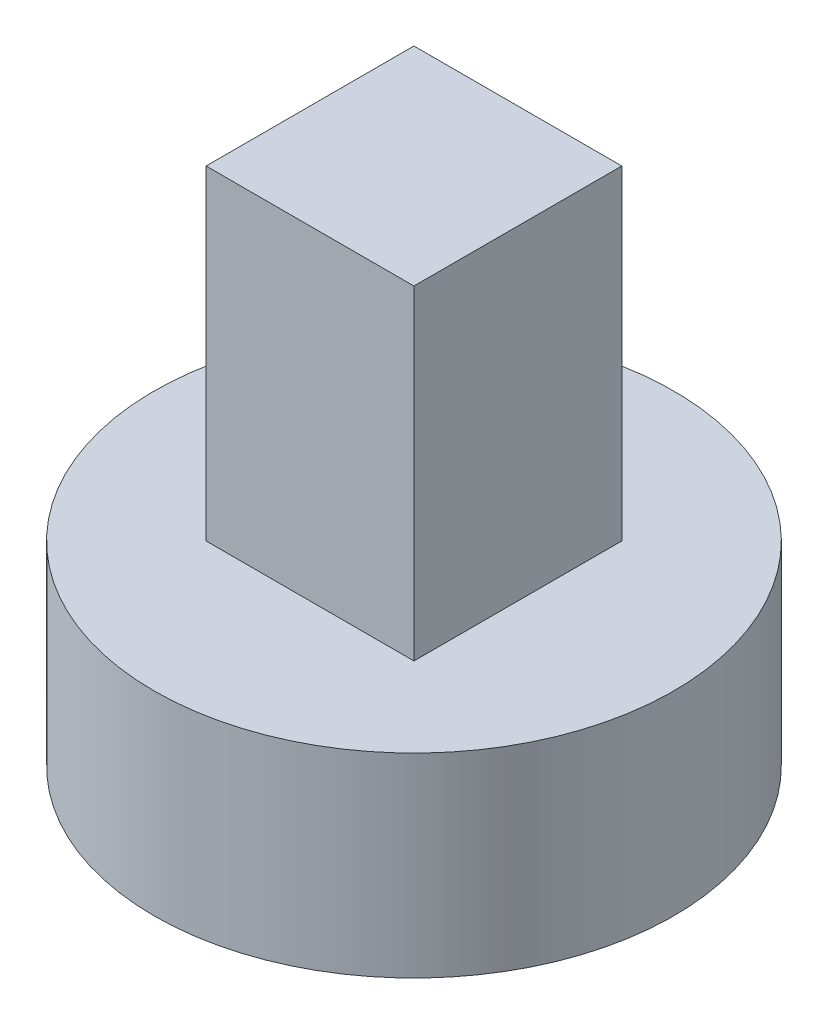
ISO-10303-21;
HEADER;
FILE_DESCRIPTION(('STEP AP214'),'2;1');
FILE_NAME('part.step','',(''),(''),'','','');
FILE_SCHEMA(('AUTOMOTIVE_DESIGN { 1 0 10303 214 1 1 1 1 }'));
ENDSEC;
DATA;
#1=APPLICATION_CONTEXT('core data for automotive mechanical design processes');
#2=APPLICATION_PROTOCOL_DEFINITION('international standard','automotive_design',2000,#1);
#3=PRODUCT_CONTEXT('',#1,'mechanical');
#4=PRODUCT('Part','Part','',(#3));
#5=PRODUCT_RELATED_PRODUCT_CATEGORY('part','',(#4));
#6=PRODUCT_DEFINITION_FORMATION('','',#4);
#7=PRODUCT_DEFINITION_CONTEXT('part definition',#1,'design');
#8=PRODUCT_DEFINITION('design','',#6,#7);
#9=PRODUCT_DEFINITION_SHAPE('','',#8);
#10=(LENGTH_UNIT() NAMED_UNIT(*) SI_UNIT(.MILLI.,.METRE.));
#11=(NAMED_UNIT(*) PLANE_ANGLE_UNIT() SI_UNIT($,.RADIAN.));
#12=(NAMED_UNIT(*) SI_UNIT($,.STERADIAN.) SOLID_ANGLE_UNIT());
#13=UNCERTAINTY_MEASURE_WITH_UNIT(LENGTH_MEASURE(1.E-05),#10,'distance_accuracy_value','');
#14=(GEOMETRIC_REPRESENTATION_CONTEXT(3) GLOBAL_UNCERTAINTY_ASSIGNED_CONTEXT((#13)) GLOBAL_UNIT_ASSIGNED_CONTEXT((#10,
#11,#12)) REPRESENTATION_CONTEXT('',''));
#15=CARTESIAN_POINT('',(0.,0.,0.));
#16=DIRECTION('',(0.,0.,1.));
#17=DIRECTION('',(1.,0.,0.));
#18=AXIS2_PLACEMENT_3D('',#15,#16,#17);
#19=CARTESIAN_POINT('',(0.,3.,0.));
#20=DIRECTION('',(0.,-1.,0.));
#21=DIRECTION('',(0.,0.,-1.));
#22=AXIS2_PLACEMENT_3D('',#19,#20,#21);
#23=CYLINDRICAL_SURFACE('',#22,4.);
#24=CARTESIAN_POINT('',(0.,3.,0.));
#25=DIRECTION('',(0.,1.,0.));
#26=DIRECTION('',(0.,0.,1.));
#27=AXIS2_PLACEMENT_3D('',#24,#25,#26);
#28=CIRCLE('',#27,4.);
#29=CARTESIAN_POINT('',(0.,3.,4.));
#30=VERTEX_POINT('',#29);
#31=EDGE_CURVE('E11',#30,#30,#28,.T.);
#32=ORIENTED_EDGE('',*,*,#31,.F.);
#33=EDGE_LOOP('',(#32));
#34=FACE_BOUND('',#33,.T.);
#35=CARTESIAN_POINT('',(0.,0.,0.));
#36=DIRECTION('',(0.,1.,0.));
#37=DIRECTION('',(0.,0.,1.));
#38=AXIS2_PLACEMENT_3D('',#35,#36,#37);
#39=CIRCLE('',#38,4.);
#40=CARTESIAN_POINT('',(0.,0.,4.));
#41=VERTEX_POINT('',#40);
#42=EDGE_CURVE('E37',#41,#41,#39,.T.);
#43=ORIENTED_EDGE('',*,*,#42,.T.);
#44=EDGE_LOOP('',(#43));
#45=FACE_BOUND('',#44,.T.);
#46=ADVANCED_FACE('F34',(#34,#45),#23,.T.);
#47=CARTESIAN_POINT('',(0.,3.,0.));
#48=DIRECTION('',(0.,1.,0.));
#49=DIRECTION('',(0.,0.,1.));
#50=AXIS2_PLACEMENT_3D('',#47,#48,#49);
#51=PLANE('',#50);
#52=DIRECTION('',(0.,0.,-1.));
#53=VECTOR('',#52,1.);
#54=CARTESIAN_POINT('',(1.6,3.,1.6));
#55=LINE('',#54,#53);
#56=CARTESIAN_POINT('',(1.6,3.,1.6));
#57=VERTEX_POINT('',#56);
#58=CARTESIAN_POINT('',(1.6,3.,-1.6));
#59=VERTEX_POINT('',#58);
#60=EDGE_CURVE('E48',#57,#59,#55,.T.);
#61=ORIENTED_EDGE('',*,*,#60,.F.);
#62=DIRECTION('',(1.,0.,0.));
#63=VECTOR('',#62,1.);
#64=CARTESIAN_POINT('',(-1.6,3.,1.6));
#65=LINE('',#64,#63);
#66=CARTESIAN_POINT('',(-1.6,3.,1.6));
#67=VERTEX_POINT('',#66);
#68=EDGE_CURVE('E52',#67,#57,#65,.T.);
#69=ORIENTED_EDGE('',*,*,#68,.F.);
#70=DIRECTION('',(0.,0.,1.));
#71=VECTOR('',#70,1.);
#72=CARTESIAN_POINT('',(-1.6,3.,-1.6));
#73=LINE('',#72,#71);
#74=CARTESIAN_POINT('',(-1.6,3.,-1.6));
#75=VERTEX_POINT('',#74);
#76=EDGE_CURVE('E104',#75,#67,#73,.T.);
#77=ORIENTED_EDGE('',*,*,#76,.F.);
#78=DIRECTION('',(-1.,0.,0.));
#79=VECTOR('',#78,1.);
#80=CARTESIAN_POINT('',(-1.6,3.,-1.6));
#81=LINE('',#80,#79);
#82=EDGE_CURVE('E106',#59,#75,#81,.T.);
#83=ORIENTED_EDGE('',*,*,#82,.F.);
#84=EDGE_LOOP('',(#61,#69,#77,#83));
#85=FACE_BOUND('',#84,.T.);
#86=ORIENTED_EDGE('',*,*,#31,.T.);
#87=EDGE_LOOP('',(#86));
#88=FACE_BOUND('',#87,.T.);
#89=ADVANCED_FACE('F124',(#85,#88),#51,.T.);
#90=CARTESIAN_POINT('',(0.,0.,0.));
#91=DIRECTION('',(0.,1.,0.));
#92=DIRECTION('',(0.,0.,1.));
#93=AXIS2_PLACEMENT_3D('',#90,#91,#92);
#94=PLANE('',#93);
#95=ORIENTED_EDGE('',*,*,#42,.F.);
#96=EDGE_LOOP('',(#95));
#97=FACE_BOUND('',#96,.T.);
#98=ADVANCED_FACE('F129',(#97),#94,.F.);
#99=CARTESIAN_POINT('',(1.6,8.,1.6));
#100=DIRECTION('',(-1.,0.,0.));
#101=DIRECTION('',(0.,0.,1.));
#102=AXIS2_PLACEMENT_3D('',#99,#100,#101);
#103=PLANE('',#102);
#104=ORIENTED_EDGE('',*,*,#60,.T.);
#105=DIRECTION('',(0.,-1.,0.));
#106=VECTOR('',#105,1.);
#107=CARTESIAN_POINT('',(1.6,8.,-1.6));
#108=LINE('',#107,#106);
#109=CARTESIAN_POINT('',(1.6,8.,-1.6));
#110=VERTEX_POINT('',#109);
#111=EDGE_CURVE('E77',#110,#59,#108,.T.);
#112=ORIENTED_EDGE('',*,*,#111,.F.);
#113=DIRECTION('',(0.,0.,-1.));
#114=VECTOR('',#113,1.);
#115=CARTESIAN_POINT('',(1.6,8.,1.6));
#116=LINE('',#115,#114);
#117=CARTESIAN_POINT('',(1.6,8.,1.6));
#118=VERTEX_POINT('',#117);
#119=EDGE_CURVE('E83',#118,#110,#116,.T.);
#120=ORIENTED_EDGE('',*,*,#119,.F.);
#121=DIRECTION('',(0.,-1.,0.));
#122=VECTOR('',#121,1.);
#123=CARTESIAN_POINT('',(1.6,8.,1.6));
#124=LINE('',#123,#122);
#125=EDGE_CURVE('E101',#118,#57,#124,.T.);
#126=ORIENTED_EDGE('',*,*,#125,.T.);
#127=EDGE_LOOP('',(#104,#112,#120,#126));
#128=FACE_BOUND('',#127,.T.);
#129=ADVANCED_FACE('F93',(#128),#103,.F.);
#130=CARTESIAN_POINT('',(-1.6,8.,-1.6));
#131=DIRECTION('',(0.,0.,1.));
#132=DIRECTION('',(1.,0.,0.));
#133=AXIS2_PLACEMENT_3D('',#130,#131,#132);
#134=PLANE('',#133);
#135=ORIENTED_EDGE('',*,*,#82,.T.);
#136=DIRECTION('',(0.,-1.,0.));
#137=VECTOR('',#136,1.);
#138=CARTESIAN_POINT('',(-1.6,8.,-1.6));
#139=LINE('',#138,#137);
#140=CARTESIAN_POINT('',(-1.6,8.,-1.6));
#141=VERTEX_POINT('',#140);
#142=EDGE_CURVE('E79',#141,#75,#139,.T.);
#143=ORIENTED_EDGE('',*,*,#142,.F.);
#144=DIRECTION('',(-1.,0.,0.));
#145=VECTOR('',#144,1.);
#146=CARTESIAN_POINT('',(-1.6,8.,-1.6));
#147=LINE('',#146,#145);
#148=EDGE_CURVE('E72',#110,#141,#147,.T.);
#149=ORIENTED_EDGE('',*,*,#148,.F.);
#150=ORIENTED_EDGE('',*,*,#111,.T.);
#151=EDGE_LOOP('',(#135,#143,#149,#150));
#152=FACE_BOUND('',#151,.T.);
#153=ADVANCED_FACE('F75',(#152),#134,.F.);
#154=CARTESIAN_POINT('',(-1.6,8.,-1.6));
#155=DIRECTION('',(1.,0.,0.));
#156=DIRECTION('',(0.,0.,-1.));
#157=AXIS2_PLACEMENT_3D('',#154,#155,#156);
#158=PLANE('',#157);
#159=ORIENTED_EDGE('',*,*,#76,.T.);
#160=DIRECTION('',(0.,-1.,0.));
#161=VECTOR('',#160,1.);
#162=CARTESIAN_POINT('',(-1.6,8.,1.6));
#163=LINE('',#162,#161);
#164=CARTESIAN_POINT('',(-1.6,8.,1.6));
#165=VERTEX_POINT('',#164);
#166=EDGE_CURVE('E96',#165,#67,#163,.T.);
#167=ORIENTED_EDGE('',*,*,#166,.F.);
#168=DIRECTION('',(0.,0.,1.));
#169=VECTOR('',#168,1.);
#170=CARTESIAN_POINT('',(-1.6,8.,-1.6));
#171=LINE('',#170,#169);
#172=EDGE_CURVE('E82',#141,#165,#171,.T.);
#173=ORIENTED_EDGE('',*,*,#172,.F.);
#174=ORIENTED_EDGE('',*,*,#142,.T.);
#175=EDGE_LOOP('',(#159,#167,#173,#174));
#176=FACE_BOUND('',#175,.T.);
#177=ADVANCED_FACE('F112',(#176),#158,.F.);
#178=CARTESIAN_POINT('',(-1.6,8.,1.6));
#179=DIRECTION('',(0.,0.,-1.));
#180=DIRECTION('',(-1.,0.,0.));
#181=AXIS2_PLACEMENT_3D('',#178,#179,#180);
#182=PLANE('',#181);
#183=ORIENTED_EDGE('',*,*,#68,.T.);
#184=ORIENTED_EDGE('',*,*,#125,.F.);
#185=DIRECTION('',(1.,0.,0.));
#186=VECTOR('',#185,1.);
#187=CARTESIAN_POINT('',(-1.6,8.,1.6));
#188=LINE('',#187,#186);
#189=EDGE_CURVE('E88',#165,#118,#188,.T.);
#190=ORIENTED_EDGE('',*,*,#189,.F.);
#191=ORIENTED_EDGE('',*,*,#166,.T.);
#192=EDGE_LOOP('',(#183,#184,#190,#191));
#193=FACE_BOUND('',#192,.T.);
#194=ADVANCED_FACE('F114',(#193),#182,.F.);
#195=CARTESIAN_POINT('',(0.,8.,0.));
#196=DIRECTION('',(0.,-1.,0.));
#197=DIRECTION('',(0.,0.,-1.));
#198=AXIS2_PLACEMENT_3D('',#195,#196,#197);
#199=PLANE('',#198);
#200=ORIENTED_EDGE('',*,*,#119,.T.);
#201=ORIENTED_EDGE('',*,*,#148,.T.);
#202=ORIENTED_EDGE('',*,*,#172,.T.);
#203=ORIENTED_EDGE('',*,*,#189,.T.);
#204=EDGE_LOOP('',(#200,#201,#202,#203));
#205=FACE_BOUND('',#204,.T.);
#206=ADVANCED_FACE('F86',(#205),#199,.F.);
#207=CLOSED_SHELL('',(#46,#89,#98,#129,#153,#177,#194,#206));
#208=MANIFOLD_SOLID_BREP('B2',#207);
#209=ADVANCED_BREP_SHAPE_REPRESENTATION('',(#18,#208),#14);
#210=SHAPE_DEFINITION_REPRESENTATION(#9,#209);
ENDSEC;
END-ISO-10303-21;
